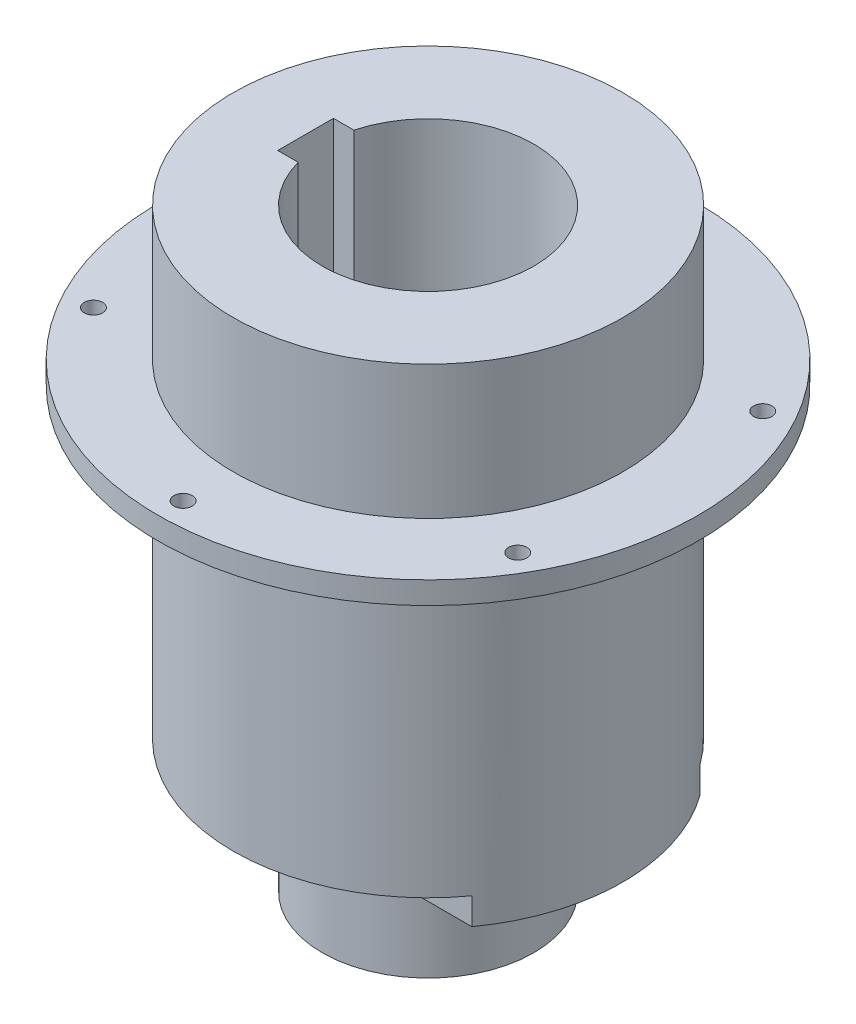
ISO-10303-21;
HEADER;
FILE_DESCRIPTION(('STEP AP214'),'2;1');
FILE_NAME('part.step','',(''),(''),'','','');
FILE_SCHEMA(('AUTOMOTIVE_DESIGN { 1 0 10303 214 1 1 1 1 }'));
ENDSEC;
DATA;
#1=APPLICATION_CONTEXT('core data for automotive mechanical design processes');
#2=APPLICATION_PROTOCOL_DEFINITION('international standard','automotive_design',2000,#1);
#3=PRODUCT_CONTEXT('',#1,'mechanical');
#4=PRODUCT('Part','Part','',(#3));
#5=PRODUCT_RELATED_PRODUCT_CATEGORY('part','',(#4));
#6=PRODUCT_DEFINITION_FORMATION('','',#4);
#7=PRODUCT_DEFINITION_CONTEXT('part definition',#1,'design');
#8=PRODUCT_DEFINITION('design','',#6,#7);
#9=PRODUCT_DEFINITION_SHAPE('','',#8);
#10=(LENGTH_UNIT() NAMED_UNIT(*) SI_UNIT(.MILLI.,.METRE.));
#11=(NAMED_UNIT(*) PLANE_ANGLE_UNIT() SI_UNIT($,.RADIAN.));
#12=(NAMED_UNIT(*) SI_UNIT($,.STERADIAN.) SOLID_ANGLE_UNIT());
#13=UNCERTAINTY_MEASURE_WITH_UNIT(LENGTH_MEASURE(1.E-05),#10,'distance_accuracy_value','');
#14=(GEOMETRIC_REPRESENTATION_CONTEXT(3) GLOBAL_UNCERTAINTY_ASSIGNED_CONTEXT((#13)) GLOBAL_UNIT_ASSIGNED_CONTEXT((#10,
#11,#12)) REPRESENTATION_CONTEXT('',''));
#15=CARTESIAN_POINT('',(0.,0.,0.));
#16=DIRECTION('',(0.,0.,1.));
#17=DIRECTION('',(1.,0.,0.));
#18=AXIS2_PLACEMENT_3D('',#15,#16,#17);
#19=CARTESIAN_POINT('',(0.,0.,0.));
#20=DIRECTION('',(0.,-1.,0.));
#21=DIRECTION('',(0.,0.,-1.));
#22=AXIS2_PLACEMENT_3D('',#19,#20,#21);
#23=CYLINDRICAL_SURFACE('',#22,35.);
#24=CARTESIAN_POINT('',(-34.9106001094224,56.8,-2.49999999999998));
#25=CARTESIAN_POINT('',(-34.9106013009842,56.9402337843813,-2.49999384622087));
#26=CARTESIAN_POINT('',(-34.9114541660582,57.0805646898059,-2.48816102267755));
#27=CARTESIAN_POINT('',(-34.9147737042987,57.3573485139249,-2.44112914296741));
#28=CARTESIAN_POINT('',(-34.9172422362129,57.4937967769307,-2.40590317341535));
#29=CARTESIAN_POINT('',(-34.9235120866206,57.7587661973504,-2.31310473405967));
#30=CARTESIAN_POINT('',(-34.9273126809974,57.88729161712,-2.25554440352309));
#31=CARTESIAN_POINT('',(-34.935817508379,58.1328240504901,-2.11973160545787));
#32=CARTESIAN_POINT('',(-34.9405215398181,58.2498336245994,-2.04148375205722));
#33=CARTESIAN_POINT('',(-34.9503133990893,58.4692701835359,-1.86635343582878));
#34=CARTESIAN_POINT('',(-34.9554018656616,58.5716720446524,-1.76943952624666));
#35=CARTESIAN_POINT('',(-34.9653833491045,58.7587709630079,-1.55979386399033));
#36=CARTESIAN_POINT('',(-34.9702763576651,58.8434672681323,-1.44706143970105));
#37=CARTESIAN_POINT('',(-34.979321378548,58.9928310580948,-1.20883323290622));
#38=CARTESIAN_POINT('',(-34.9834726035498,59.0574773149427,-1.08332410847656));
#39=CARTESIAN_POINT('',(-34.990559516592,59.1647700979797,-0.823198604146575));
#40=CARTESIAN_POINT('',(-34.9934952208912,59.2074169184361,-0.688582346091626));
#41=CARTESIAN_POINT('',(-34.9978158775822,59.2694293219075,-0.414309673484041));
#42=CARTESIAN_POINT('',(-34.9992034916227,59.288834868138,-0.274662337109923));
#43=CARTESIAN_POINT('',(-35.0002806084736,59.3039373357045,0.00591390353006725));
#44=CARTESIAN_POINT('',(-34.9999701353268,59.2996345927193,0.146842789622639));
#45=CARTESIAN_POINT('',(-34.9976882707688,59.2674754683555,0.425710880401213));
#46=CARTESIAN_POINT('',(-34.9957199102546,59.2396620680792,0.56365506991908));
#47=CARTESIAN_POINT('',(-34.9903472796657,59.1613379016685,0.83291189606865));
#48=CARTESIAN_POINT('',(-34.9869429990408,59.1108269687671,0.964224483967682));
#49=CARTESIAN_POINT('',(-34.9790764811396,58.988493187728,1.21662813510538));
#50=CARTESIAN_POINT('',(-34.9746132821527,58.9166509514763,1.33770977022086));
#51=CARTESIAN_POINT('',(-34.9651309405075,58.7537079910797,1.5661115188349));
#52=CARTESIAN_POINT('',(-34.9601117896154,58.6626069816829,1.67343142846343));
#53=CARTESIAN_POINT('',(-34.9500688682285,58.4634899476908,1.87151434561126));
#54=CARTESIAN_POINT('',(-34.9450451124509,58.3554366007797,1.96223984092649));
#55=CARTESIAN_POINT('',(-34.9355705444722,58.1256126128757,2.1242691127521));
#56=CARTESIAN_POINT('',(-34.931119732582,58.0038419644388,2.19557287872282));
#57=CARTESIAN_POINT('',(-34.9232938755889,57.7500151660184,2.31673245908851));
#58=CARTESIAN_POINT('',(-34.9199189169748,57.6179581901699,2.36658654923887));
#59=CARTESIAN_POINT('',(-34.9146282757894,57.3473189203907,2.44340496961031));
#60=CARTESIAN_POINT('',(-34.9127125707554,57.2087367269391,2.47036965217412));
#61=CARTESIAN_POINT('',(-34.9105607163687,56.9293084795045,2.50059679826772));
#62=CARTESIAN_POINT('',(-34.9103208674152,56.7884681005791,2.50391147163281));
#63=CARTESIAN_POINT('',(-34.911538102081,56.5082334937383,2.48688105832807));
#64=CARTESIAN_POINT('',(-34.9129951741237,56.3688392559636,2.46653613306751));
#65=CARTESIAN_POINT('',(-34.9174386845258,56.095602342522,2.40280747129512));
#66=CARTESIAN_POINT('',(-34.9204235182308,55.9617540009607,2.35944790599135));
#67=CARTESIAN_POINT('',(-34.9275848607993,55.7032332103979,2.25094529934471));
#68=CARTESIAN_POINT('',(-34.9317613837642,55.5785608699995,2.18580200022983));
#69=CARTESIAN_POINT('',(-34.9408444549612,55.3416916023663,2.03544819945193));
#70=CARTESIAN_POINT('',(-34.9457522675833,55.2295168823526,1.95020278976708));
#71=CARTESIAN_POINT('',(-34.9557405275265,55.0210510806753,1.76211522324265));
#72=CARTESIAN_POINT('',(-34.9608209770392,54.9247602007512,1.65927284293908));
#73=CARTESIAN_POINT('',(-34.9705929477922,54.7506183354553,1.43868558630042));
#74=CARTESIAN_POINT('',(-34.9752837452292,54.672801189308,1.32091395926634));
#75=CARTESIAN_POINT('',(-34.9837374668193,54.5380475327259,1.07394533913416));
#76=CARTESIAN_POINT('',(-34.9875003981072,54.4811108617317,0.944748433899802));
#77=CARTESIAN_POINT('',(-34.9936710038533,54.3897929492319,0.678719845089252));
#78=CARTESIAN_POINT('',(-34.9960799531813,54.3553904851127,0.541895477216689));
#79=CARTESIAN_POINT('',(-34.9992762933682,54.3100481280665,0.264394743307918));
#80=CARTESIAN_POINT('',(-35.0000637059758,54.2991079204535,0.123718428961321));
#81=CARTESIAN_POINT('',(-34.9999283072413,54.301003895361,-0.157158551507434));
#82=CARTESIAN_POINT('',(-34.9990092986799,54.3137872096869,-0.297359579385089));
#83=CARTESIAN_POINT('',(-34.9955718973575,54.3626574887243,-0.573618716668832));
#84=CARTESIAN_POINT('',(-34.9930535020031,54.3987444912206,-0.709676819357165));
#85=CARTESIAN_POINT('',(-34.9867001855664,54.4931851850029,-0.973793948539717));
#86=CARTESIAN_POINT('',(-34.9828652960376,54.5515383426196,-1.10185316666349));
#87=CARTESIAN_POINT('',(-34.9743089538449,54.6888482548665,-1.34636475268572));
#88=CARTESIAN_POINT('',(-34.9695875206224,54.7678045576959,-1.46281737502471));
#89=CARTESIAN_POINT('',(-34.95977620993,54.9442767570964,-1.68107963152584));
#90=CARTESIAN_POINT('',(-34.9546855778527,55.0418313693029,-1.78285792822938));
#91=CARTESIAN_POINT('',(-34.9447158885714,55.2526693719169,-1.96863172921551));
#92=CARTESIAN_POINT('',(-34.9398368832279,55.3659565894402,-2.05262289400752));
#93=CARTESIAN_POINT('',(-34.9308348795401,55.6052085770741,-2.20052035377927));
#94=CARTESIAN_POINT('',(-34.9267130155451,55.7311919382521,-2.2643966132442));
#95=CARTESIAN_POINT('',(-34.9197061867511,55.9920354706788,-2.37001000657714));
#96=CARTESIAN_POINT('',(-34.9168197844766,56.1268851138955,-2.41177288314433));
#97=CARTESIAN_POINT('',(-34.9133616093181,56.3521237055961,-2.46120496726509));
#98=CARTESIAN_POINT('',(-34.9123307263929,56.4410594479864,-2.47573408624045));
#99=CARTESIAN_POINT('',(-34.9109495946005,56.6199834521708,-2.4951335688605));
#100=CARTESIAN_POINT('',(-34.910599344455,56.7099717119875,-2.50000395064711));
#101=CARTESIAN_POINT('',(-34.9106001094224,56.8,-2.49999999999998));
#102=B_SPLINE_CURVE_WITH_KNOTS('',3,(#24,#25,#26,#27,#28,#29,#30,#31,#32,#33,#34,#35,#36,#37,
#38,#39,#40,#41,#42,#43,#44,#45,#46,#47,#48,#49,#50,#51,#52,#53,#54,#55,#56,#57,#58,#59,#60,#61,
#62,#63,#64,#65,#66,#67,#68,#69,#70,#71,#72,#73,#74,#75,#76,#77,#78,#79,#80,#81,#82,#83,#84,#85,
#86,#87,#88,#89,#90,#91,#92,#93,#94,#95,#96,#97,#98,#99,#100,#101),.UNSPECIFIED.,.T.,.F.,(4,2,2,
2,2,2,2,2,2,2,2,2,2,2,2,2,2,2,2,2,2,2,2,2,2,2,2,2,2,2,2,2,2,2,2,2,2,2,4),(0.,0.420372674340742,
0.841229819528212,1.26185853834788,1.68239351951577,2.10364327403619,2.52491091919571,
2.94662307084332,3.3683295814714,3.78930992470611,4.21028430741624,4.63049074442442,
5.05070026889243,5.47129289888782,5.89189175894008,6.31342995236851,6.73496837455419,
7.15654067602209,7.57810648799805,7.99874136118442,8.41937336475452,8.83956446964642,
9.25976054693389,9.68069175383475,10.101628306539,10.5233300601264,10.9450285709861,
11.3663293548796,11.7876244880682,12.2079818864761,12.6283399664575,13.0486879720403,
13.4690267606991,13.8902503059564,14.3115764981829,14.7335288625457,15.1549889364476,
15.4248632998187,15.6947371562869),.UNSPECIFIED.);
#103=CARTESIAN_POINT('',(-34.9106001094224,56.8,-2.49999999999998));
#104=VERTEX_POINT('',#103);
#105=EDGE_CURVE('E40',#104,#104,#102,.T.);
#106=ORIENTED_EDGE('',*,*,#105,.T.);
#107=EDGE_LOOP('',(#106));
#108=FACE_BOUND('',#107,.T.);
#109=CARTESIAN_POINT('',(0.,23.8,0.));
#110=DIRECTION('',(0.,1.,0.));
#111=DIRECTION('',(0.,0.,1.));
#112=AXIS2_PLACEMENT_3D('',#109,#110,#111);
#113=CIRCLE('',#112,35.);
#114=CARTESIAN_POINT('',(28.3681159050086,23.8,-20.5));
#115=VERTEX_POINT('',#114);
#116=CARTESIAN_POINT('',(-28.3681159050086,23.8,-20.5));
#117=VERTEX_POINT('',#116);
#118=EDGE_CURVE('E11',#115,#117,#113,.T.);
#119=ORIENTED_EDGE('',*,*,#118,.T.);
#120=DIRECTION('',(0.,-1.,0.));
#121=VECTOR('',#120,1.);
#122=CARTESIAN_POINT('',(-28.3681159050086,0.,-20.5));
#123=LINE('',#122,#121);
#124=CARTESIAN_POINT('',(-28.3681159050086,19.,-20.5));
#125=VERTEX_POINT('',#124);
#126=EDGE_CURVE('E213',#117,#125,#123,.T.);
#127=ORIENTED_EDGE('',*,*,#126,.T.);
#128=CARTESIAN_POINT('',(0.,19.,0.));
#129=DIRECTION('',(0.,-1.,0.));
#130=DIRECTION('',(0.,0.,-1.));
#131=AXIS2_PLACEMENT_3D('',#128,#129,#130);
#132=CIRCLE('',#131,35.);
#133=CARTESIAN_POINT('',(-28.3681159050086,19.,20.5));
#134=VERTEX_POINT('',#133);
#135=EDGE_CURVE('E293',#134,#125,#132,.T.);
#136=ORIENTED_EDGE('',*,*,#135,.F.);
#137=DIRECTION('',(0.,-1.,0.));
#138=VECTOR('',#137,1.);
#139=CARTESIAN_POINT('',(-28.3681159050086,0.,20.5));
#140=LINE('',#139,#138);
#141=CARTESIAN_POINT('',(-28.3681159050086,23.8,20.5));
#142=VERTEX_POINT('',#141);
#143=EDGE_CURVE('E65',#134,#142,#140,.F.);
#144=ORIENTED_EDGE('',*,*,#143,.T.);
#145=CARTESIAN_POINT('',(0.,23.8,0.));
#146=DIRECTION('',(0.,1.,0.));
#147=DIRECTION('',(0.,0.,1.));
#148=AXIS2_PLACEMENT_3D('',#145,#146,#147);
#149=CIRCLE('',#148,35.);
#150=CARTESIAN_POINT('',(28.3681159050086,23.8,20.5));
#151=VERTEX_POINT('',#150);
#152=EDGE_CURVE('E316',#142,#151,#149,.T.);
#153=ORIENTED_EDGE('',*,*,#152,.T.);
#154=DIRECTION('',(0.,-1.,0.));
#155=VECTOR('',#154,1.);
#156=CARTESIAN_POINT('',(28.3681159050086,0.,20.5));
#157=LINE('',#156,#155);
#158=CARTESIAN_POINT('',(28.3681159050085,19.,20.5));
#159=VERTEX_POINT('',#158);
#160=EDGE_CURVE('E220',#151,#159,#157,.T.);
#161=ORIENTED_EDGE('',*,*,#160,.T.);
#162=CARTESIAN_POINT('',(28.3681159050086,19.,-20.5));
#163=VERTEX_POINT('',#162);
#164=EDGE_CURVE('E292',#163,#159,#132,.T.);
#165=ORIENTED_EDGE('',*,*,#164,.F.);
#166=DIRECTION('',(0.,-1.,0.));
#167=VECTOR('',#166,1.);
#168=CARTESIAN_POINT('',(28.3681159050086,0.,-20.5));
#169=LINE('',#168,#167);
#170=EDGE_CURVE('E57',#163,#115,#169,.F.);
#171=ORIENTED_EDGE('',*,*,#170,.T.);
#172=EDGE_LOOP('',(#119,#127,#136,#144,#153,#161,#165,#171));
#173=FACE_BOUND('',#172,.T.);
#174=CARTESIAN_POINT('',(0.,78.8,0.));
#175=DIRECTION('',(0.,1.,0.));
#176=DIRECTION('',(0.,0.,1.));
#177=AXIS2_PLACEMENT_3D('',#174,#175,#176);
#178=CIRCLE('',#177,35.);
#179=CARTESIAN_POINT('',(0.,78.8,35.));
#180=VERTEX_POINT('',#179);
#181=EDGE_CURVE('E311',#180,#180,#178,.T.);
#182=ORIENTED_EDGE('',*,*,#181,.F.);
#183=EDGE_LOOP('',(#182));
#184=FACE_BOUND('',#183,.T.);
#185=ADVANCED_FACE('F36',(#108,#173,#184),#23,.T.);
#186=CARTESIAN_POINT('',(0.,106.8,0.));
#187=DIRECTION('',(0.,-1.,0.));
#188=DIRECTION('',(0.,0.,-1.));
#189=AXIS2_PLACEMENT_3D('',#186,#187,#188);
#190=CIRCLE('',#189,35.);
#191=CARTESIAN_POINT('',(0.,106.8,-35.));
#192=VERTEX_POINT('',#191);
#193=EDGE_CURVE('E296',#192,#192,#190,.T.);
#194=ORIENTED_EDGE('',*,*,#193,.T.);
#195=EDGE_LOOP('',(#194));
#196=FACE_BOUND('',#195,.T.);
#197=CARTESIAN_POINT('',(0.,82.8,0.));
#198=DIRECTION('',(0.,-1.,0.));
#199=DIRECTION('',(0.,0.,-1.));
#200=AXIS2_PLACEMENT_3D('',#197,#198,#199);
#201=CIRCLE('',#200,35.);
#202=CARTESIAN_POINT('',(0.,82.8,-35.));
#203=VERTEX_POINT('',#202);
#204=EDGE_CURVE('E308',#203,#203,#201,.T.);
#205=ORIENTED_EDGE('',*,*,#204,.F.);
#206=EDGE_LOOP('',(#205));
#207=FACE_BOUND('',#206,.T.);
#208=ADVANCED_FACE('F346',(#196,#207),#23,.T.);
#209=CARTESIAN_POINT('',(0.,0.,0.));
#210=DIRECTION('',(0.,-1.,0.));
#211=DIRECTION('',(0.,0.,-1.));
#212=AXIS2_PLACEMENT_3D('',#209,#210,#211);
#213=CYLINDRICAL_SURFACE('',#212,6.5);
#214=CARTESIAN_POINT('',(0.,26.3,0.));
#215=DIRECTION('',(0.,-1.,0.));
#216=DIRECTION('',(0.,0.,-1.));
#217=AXIS2_PLACEMENT_3D('',#214,#215,#216);
#218=CIRCLE('',#217,6.5);
#219=CARTESIAN_POINT('',(0.,26.3,-6.5));
#220=VERTEX_POINT('',#219);
#221=EDGE_CURVE('E305',#220,#220,#218,.T.);
#222=ORIENTED_EDGE('',*,*,#221,.F.);
#223=EDGE_LOOP('',(#222));
#224=FACE_BOUND('',#223,.T.);
#225=CARTESIAN_POINT('',(0.,15.,0.));
#226=DIRECTION('',(0.,-1.,0.));
#227=DIRECTION('',(0.,0.,-1.));
#228=AXIS2_PLACEMENT_3D('',#225,#226,#227);
#229=CIRCLE('',#228,6.5);
#230=CARTESIAN_POINT('',(0.,15.,-6.5));
#231=VERTEX_POINT('',#230);
#232=EDGE_CURVE('E277',#231,#231,#229,.T.);
#233=ORIENTED_EDGE('',*,*,#232,.T.);
#234=EDGE_LOOP('',(#233));
#235=FACE_BOUND('',#234,.T.);
#236=ADVANCED_FACE('F38',(#224,#235),#213,.F.);
#237=CARTESIAN_POINT('',(-6.5,26.3,0.));
#238=DIRECTION('',(0.,-1.,0.));
#239=DIRECTION('',(0.,0.,-1.));
#240=AXIS2_PLACEMENT_3D('',#237,#238,#239);
#241=PLANE('',#240);
#242=DIRECTION('',(0.,0.,-1.));
#243=VECTOR('',#242,1.);
#244=CARTESIAN_POINT('',(-14.,26.3,-5.));
#245=LINE('',#244,#243);
#246=CARTESIAN_POINT('',(-14.,26.3,5.));
#247=VERTEX_POINT('',#246);
#248=CARTESIAN_POINT('',(-14.,26.3,-5.));
#249=VERTEX_POINT('',#248);
#250=EDGE_CURVE('E246',#247,#249,#245,.T.);
#251=ORIENTED_EDGE('',*,*,#250,.F.);
#252=DIRECTION('',(1.,0.,0.));
#253=VECTOR('',#252,1.);
#254=CARTESIAN_POINT('',(-22.,26.3,5.));
#255=LINE('',#254,#253);
#256=CARTESIAN_POINT('',(-18.3303027798234,26.3,5.));
#257=VERTEX_POINT('',#256);
#258=EDGE_CURVE('E249',#257,#247,#255,.T.);
#259=ORIENTED_EDGE('',*,*,#258,.F.);
#260=CARTESIAN_POINT('',(0.,26.3,0.));
#261=DIRECTION('',(0.,-1.,0.));
#262=DIRECTION('',(0.,0.,-1.));
#263=AXIS2_PLACEMENT_3D('',#260,#261,#262);
#264=CIRCLE('',#263,19.);
#265=CARTESIAN_POINT('',(-18.3303027798234,26.3,-5.));
#266=VERTEX_POINT('',#265);
#267=EDGE_CURVE('E302',#266,#257,#264,.T.);
#268=ORIENTED_EDGE('',*,*,#267,.F.);
#269=DIRECTION('',(-1.,0.,0.));
#270=VECTOR('',#269,1.);
#271=CARTESIAN_POINT('',(-22.,26.3,-5.));
#272=LINE('',#271,#270);
#273=EDGE_CURVE('E275',#249,#266,#272,.T.);
#274=ORIENTED_EDGE('',*,*,#273,.F.);
#275=EDGE_LOOP('',(#251,#259,#268,#274));
#276=FACE_BOUND('',#275,.T.);
#277=ORIENTED_EDGE('',*,*,#221,.T.);
#278=EDGE_LOOP('',(#277));
#279=FACE_BOUND('',#278,.T.);
#280=ADVANCED_FACE('F365',(#276,#279),#241,.F.);
#281=CARTESIAN_POINT('',(0.,0.,0.));
#282=DIRECTION('',(0.,-1.,0.));
#283=DIRECTION('',(0.,0.,-1.));
#284=AXIS2_PLACEMENT_3D('',#281,#282,#283);
#285=CYLINDRICAL_SURFACE('',#284,19.);
#286=ORIENTED_EDGE('',*,*,#267,.T.);
#287=DIRECTION('',(0.,-1.,0.));
#288=VECTOR('',#287,1.);
#289=CARTESIAN_POINT('',(-18.3303027798234,0.,5.));
#290=LINE('',#289,#288);
#291=CARTESIAN_POINT('',(-18.3303027798234,106.8,5.));
#292=VERTEX_POINT('',#291);
#293=EDGE_CURVE('E231',#292,#257,#290,.T.);
#294=ORIENTED_EDGE('',*,*,#293,.F.);
#295=CARTESIAN_POINT('',(0.,106.8,0.));
#296=DIRECTION('',(0.,-1.,0.));
#297=DIRECTION('',(0.,0.,-1.));
#298=AXIS2_PLACEMENT_3D('',#295,#296,#297);
#299=CIRCLE('',#298,19.);
#300=CARTESIAN_POINT('',(-18.3303027798234,106.8,-5.));
#301=VERTEX_POINT('',#300);
#302=EDGE_CURVE('E299',#301,#292,#299,.T.);
#303=ORIENTED_EDGE('',*,*,#302,.F.);
#304=DIRECTION('',(0.,-1.,0.));
#305=VECTOR('',#304,1.);
#306=CARTESIAN_POINT('',(-18.3303027798234,0.,-5.));
#307=LINE('',#306,#305);
#308=EDGE_CURVE('E229',#266,#301,#307,.F.);
#309=ORIENTED_EDGE('',*,*,#308,.F.);
#310=EDGE_LOOP('',(#286,#294,#303,#309));
#311=FACE_BOUND('',#310,.T.);
#312=ADVANCED_FACE('F362',(#311),#285,.F.);
#313=CARTESIAN_POINT('',(-19.,106.8,0.));
#314=DIRECTION('',(0.,-1.,0.));
#315=DIRECTION('',(0.,0.,-1.));
#316=AXIS2_PLACEMENT_3D('',#313,#314,#315);
#317=PLANE('',#316);
#318=ORIENTED_EDGE('',*,*,#193,.F.);
#319=EDGE_LOOP('',(#318));
#320=FACE_BOUND('',#319,.T.);
#321=ORIENTED_EDGE('',*,*,#302,.T.);
#322=DIRECTION('',(1.,0.,0.));
#323=VECTOR('',#322,1.);
#324=CARTESIAN_POINT('',(-22.,106.8,5.));
#325=LINE('',#324,#323);
#326=CARTESIAN_POINT('',(-22.,106.8,5.));
#327=VERTEX_POINT('',#326);
#328=EDGE_CURVE('E258',#327,#292,#325,.T.);
#329=ORIENTED_EDGE('',*,*,#328,.F.);
#330=DIRECTION('',(0.,0.,1.));
#331=VECTOR('',#330,1.);
#332=CARTESIAN_POINT('',(-22.,106.8,-5.));
#333=LINE('',#332,#331);
#334=CARTESIAN_POINT('',(-22.,106.8,-5.));
#335=VERTEX_POINT('',#334);
#336=EDGE_CURVE('E255',#335,#327,#333,.T.);
#337=ORIENTED_EDGE('',*,*,#336,.F.);
#338=DIRECTION('',(-1.,0.,0.));
#339=VECTOR('',#338,1.);
#340=CARTESIAN_POINT('',(-22.,106.8,-5.));
#341=LINE('',#340,#339);
#342=EDGE_CURVE('E252',#301,#335,#341,.T.);
#343=ORIENTED_EDGE('',*,*,#342,.F.);
#344=EDGE_LOOP('',(#321,#329,#337,#343));
#345=FACE_BOUND('',#344,.T.);
#346=ADVANCED_FACE('F359',(#320,#345),#317,.F.);
#347=CARTESIAN_POINT('',(-35.,19.,0.));
#348=DIRECTION('',(0.,1.,0.));
#349=DIRECTION('',(0.,0.,1.));
#350=AXIS2_PLACEMENT_3D('',#347,#348,#349);
#351=PLANE('',#350);
#352=CARTESIAN_POINT('',(27.5,19.,0.));
#353=DIRECTION('',(0.,-1.,0.));
#354=DIRECTION('',(0.,0.,-1.));
#355=AXIS2_PLACEMENT_3D('',#352,#353,#354);
#356=CIRCLE('',#355,3.49999999999999);
#357=CARTESIAN_POINT('',(27.5,19.,-3.49999999999999));
#358=VERTEX_POINT('',#357);
#359=EDGE_CURVE('E155',#358,#358,#356,.T.);
#360=ORIENTED_EDGE('',*,*,#359,.F.);
#361=EDGE_LOOP('',(#360));
#362=FACE_BOUND('',#361,.T.);
#363=CARTESIAN_POINT('',(-27.5,19.,0.));
#364=DIRECTION('',(0.,-1.,0.));
#365=DIRECTION('',(0.,0.,-1.));
#366=AXIS2_PLACEMENT_3D('',#363,#364,#365);
#367=CIRCLE('',#366,3.49999999999999);
#368=CARTESIAN_POINT('',(-27.5,19.,-3.49999999999999));
#369=VERTEX_POINT('',#368);
#370=EDGE_CURVE('E154',#369,#369,#367,.T.);
#371=ORIENTED_EDGE('',*,*,#370,.F.);
#372=EDGE_LOOP('',(#371));
#373=FACE_BOUND('',#372,.T.);
#374=DIRECTION('',(0.,0.,-1.));
#375=VECTOR('',#374,1.);
#376=CARTESIAN_POINT('',(-22.,19.,-5.));
#377=LINE('',#376,#375);
#378=CARTESIAN_POINT('',(-22.,19.,5.));
#379=VERTEX_POINT('',#378);
#380=CARTESIAN_POINT('',(-22.,19.,-5.));
#381=VERTEX_POINT('',#380);
#382=EDGE_CURVE('E240',#379,#381,#377,.T.);
#383=ORIENTED_EDGE('',*,*,#382,.F.);
#384=DIRECTION('',(-1.,0.,0.));
#385=VECTOR('',#384,1.);
#386=CARTESIAN_POINT('',(-22.,19.,5.));
#387=LINE('',#386,#385);
#388=CARTESIAN_POINT('',(-18.3303027798234,19.,5.));
#389=VERTEX_POINT('',#388);
#390=EDGE_CURVE('E243',#389,#379,#387,.T.);
#391=ORIENTED_EDGE('',*,*,#390,.F.);
#392=CARTESIAN_POINT('',(0.,19.,0.));
#393=DIRECTION('',(0.,-1.,0.));
#394=DIRECTION('',(0.,0.,-1.));
#395=AXIS2_PLACEMENT_3D('',#392,#393,#394);
#396=CIRCLE('',#395,19.);
#397=CARTESIAN_POINT('',(-18.3303027798234,19.,-5.));
#398=VERTEX_POINT('',#397);
#399=EDGE_CURVE('E289',#398,#389,#396,.T.);
#400=ORIENTED_EDGE('',*,*,#399,.F.);
#401=DIRECTION('',(1.,0.,0.));
#402=VECTOR('',#401,1.);
#403=CARTESIAN_POINT('',(-22.,19.,-5.));
#404=LINE('',#403,#402);
#405=EDGE_CURVE('E273',#381,#398,#404,.T.);
#406=ORIENTED_EDGE('',*,*,#405,.F.);
#407=EDGE_LOOP('',(#383,#391,#400,#406));
#408=FACE_BOUND('',#407,.T.);
#409=ORIENTED_EDGE('',*,*,#135,.T.);
#410=DIRECTION('',(1.,0.,0.));
#411=VECTOR('',#410,1.);
#412=CARTESIAN_POINT('',(-35.,19.,-20.5));
#413=LINE('',#412,#411);
#414=EDGE_CURVE('E49',#125,#163,#413,.T.);
#415=ORIENTED_EDGE('',*,*,#414,.T.);
#416=ORIENTED_EDGE('',*,*,#164,.T.);
#417=DIRECTION('',(-1.,0.,0.));
#418=VECTOR('',#417,1.);
#419=CARTESIAN_POINT('',(-35.,19.,20.5));
#420=LINE('',#419,#418);
#421=EDGE_CURVE('E314',#159,#134,#420,.T.);
#422=ORIENTED_EDGE('',*,*,#421,.T.);
#423=EDGE_LOOP('',(#409,#415,#416,#422));
#424=FACE_BOUND('',#423,.T.);
#425=ADVANCED_FACE('F357',(#362,#373,#408,#424),#351,.F.);
#426=CARTESIAN_POINT('',(0.,0.,0.));
#427=DIRECTION('',(0.,-1.,0.));
#428=DIRECTION('',(0.,0.,-1.));
#429=AXIS2_PLACEMENT_3D('',#426,#427,#428);
#430=CYLINDRICAL_SURFACE('',#429,19.);
#431=ORIENTED_EDGE('',*,*,#399,.T.);
#432=DIRECTION('',(0.,-1.,0.));
#433=VECTOR('',#432,1.);
#434=CARTESIAN_POINT('',(-18.3303027798234,0.,5.));
#435=LINE('',#434,#433);
#436=CARTESIAN_POINT('',(-18.3303027798234,0.,5.));
#437=VERTEX_POINT('',#436);
#438=EDGE_CURVE('E238',#437,#389,#435,.F.);
#439=ORIENTED_EDGE('',*,*,#438,.F.);
#440=CARTESIAN_POINT('',(0.,0.,0.));
#441=DIRECTION('',(0.,-1.,0.));
#442=DIRECTION('',(0.,0.,-1.));
#443=AXIS2_PLACEMENT_3D('',#440,#441,#442);
#444=CIRCLE('',#443,19.);
#445=CARTESIAN_POINT('',(-18.3303027798234,0.,-5.));
#446=VERTEX_POINT('',#445);
#447=EDGE_CURVE('E286',#446,#437,#444,.T.);
#448=ORIENTED_EDGE('',*,*,#447,.F.);
#449=DIRECTION('',(0.,-1.,0.));
#450=VECTOR('',#449,1.);
#451=CARTESIAN_POINT('',(-18.3303027798234,0.,-5.));
#452=LINE('',#451,#450);
#453=EDGE_CURVE('E271',#398,#446,#452,.T.);
#454=ORIENTED_EDGE('',*,*,#453,.F.);
#455=EDGE_LOOP('',(#431,#439,#448,#454));
#456=FACE_BOUND('',#455,.T.);
#457=ADVANCED_FACE('F397',(#456),#430,.T.);
#458=CARTESIAN_POINT('',(-19.,0.,0.));
#459=DIRECTION('',(0.,1.,0.));
#460=DIRECTION('',(0.,0.,1.));
#461=AXIS2_PLACEMENT_3D('',#458,#459,#460);
#462=PLANE('',#461);
#463=CARTESIAN_POINT('',(0.,0.,0.));
#464=DIRECTION('',(0.,-1.,0.));
#465=DIRECTION('',(0.,0.,-1.));
#466=AXIS2_PLACEMENT_3D('',#463,#464,#465);
#467=CIRCLE('',#466,10.);
#468=CARTESIAN_POINT('',(0.,0.,-10.));
#469=VERTEX_POINT('',#468);
#470=EDGE_CURVE('E283',#469,#469,#467,.T.);
#471=ORIENTED_EDGE('',*,*,#470,.F.);
#472=EDGE_LOOP('',(#471));
#473=FACE_BOUND('',#472,.T.);
#474=ORIENTED_EDGE('',*,*,#447,.T.);
#475=DIRECTION('',(-1.,0.,0.));
#476=VECTOR('',#475,1.);
#477=CARTESIAN_POINT('',(-22.,0.,5.));
#478=LINE('',#477,#476);
#479=CARTESIAN_POINT('',(-14.,0.,5.));
#480=VERTEX_POINT('',#479);
#481=EDGE_CURVE('E236',#480,#437,#478,.T.);
#482=ORIENTED_EDGE('',*,*,#481,.F.);
#483=DIRECTION('',(0.,0.,1.));
#484=VECTOR('',#483,1.);
#485=CARTESIAN_POINT('',(-14.,0.,-5.));
#486=LINE('',#485,#484);
#487=CARTESIAN_POINT('',(-14.,0.,-5.));
#488=VERTEX_POINT('',#487);
#489=EDGE_CURVE('E233',#488,#480,#486,.T.);
#490=ORIENTED_EDGE('',*,*,#489,.F.);
#491=DIRECTION('',(1.,0.,0.));
#492=VECTOR('',#491,1.);
#493=CARTESIAN_POINT('',(-22.,0.,-5.));
#494=LINE('',#493,#492);
#495=EDGE_CURVE('E263',#446,#488,#494,.T.);
#496=ORIENTED_EDGE('',*,*,#495,.F.);
#497=EDGE_LOOP('',(#474,#482,#490,#496));
#498=FACE_BOUND('',#497,.T.);
#499=ADVANCED_FACE('F391',(#473,#498),#462,.F.);
#500=CARTESIAN_POINT('',(0.,0.,0.));
#501=DIRECTION('',(0.,-1.,0.));
#502=DIRECTION('',(0.,0.,-1.));
#503=AXIS2_PLACEMENT_3D('',#500,#501,#502);
#504=CYLINDRICAL_SURFACE('',#503,10.);
#505=CARTESIAN_POINT('',(0.,15.,0.));
#506=DIRECTION('',(0.,-1.,0.));
#507=DIRECTION('',(0.,0.,-1.));
#508=AXIS2_PLACEMENT_3D('',#505,#506,#507);
#509=CIRCLE('',#508,10.);
#510=CARTESIAN_POINT('',(0.,15.,-10.));
#511=VERTEX_POINT('',#510);
#512=EDGE_CURVE('E280',#511,#511,#509,.T.);
#513=ORIENTED_EDGE('',*,*,#512,.F.);
#514=EDGE_LOOP('',(#513));
#515=FACE_BOUND('',#514,.T.);
#516=ORIENTED_EDGE('',*,*,#470,.T.);
#517=EDGE_LOOP('',(#516));
#518=FACE_BOUND('',#517,.T.);
#519=ADVANCED_FACE('F385',(#515,#518),#504,.F.);
#520=CARTESIAN_POINT('',(-10.,15.,0.));
#521=DIRECTION('',(0.,1.,0.));
#522=DIRECTION('',(0.,0.,1.));
#523=AXIS2_PLACEMENT_3D('',#520,#521,#522);
#524=PLANE('',#523);
#525=ORIENTED_EDGE('',*,*,#232,.F.);
#526=EDGE_LOOP('',(#525));
#527=FACE_BOUND('',#526,.T.);
#528=ORIENTED_EDGE('',*,*,#512,.T.);
#529=EDGE_LOOP('',(#528));
#530=FACE_BOUND('',#529,.T.);
#531=ADVANCED_FACE('F381',(#527,#530),#524,.F.);
#532=CARTESIAN_POINT('',(-14.,-0.001000000000001,-5.));
#533=DIRECTION('',(1.,0.,0.));
#534=DIRECTION('',(0.,0.,-1.));
#535=AXIS2_PLACEMENT_3D('',#532,#533,#534);
#536=PLANE('',#535);
#537=ORIENTED_EDGE('',*,*,#250,.T.);
#538=DIRECTION('',(0.,1.,0.));
#539=VECTOR('',#538,1.);
#540=CARTESIAN_POINT('',(-14.,-0.001000000000001,-5.));
#541=LINE('',#540,#539);
#542=EDGE_CURVE('E260',#488,#249,#541,.T.);
#543=ORIENTED_EDGE('',*,*,#542,.F.);
#544=ORIENTED_EDGE('',*,*,#489,.T.);
#545=DIRECTION('',(0.,1.,0.));
#546=VECTOR('',#545,1.);
#547=CARTESIAN_POINT('',(-14.,-0.001000000000001,5.));
#548=LINE('',#547,#546);
#549=EDGE_CURVE('E261',#480,#247,#548,.T.);
#550=ORIENTED_EDGE('',*,*,#549,.T.);
#551=EDGE_LOOP('',(#537,#543,#544,#550));
#552=FACE_BOUND('',#551,.T.);
#553=ADVANCED_FACE('F384',(#552),#536,.F.);
#554=CARTESIAN_POINT('',(-22.,-0.001000000000001,5.));
#555=DIRECTION('',(0.,0.,1.));
#556=DIRECTION('',(1.,0.,0.));
#557=AXIS2_PLACEMENT_3D('',#554,#555,#556);
#558=PLANE('',#557);
#559=ORIENTED_EDGE('',*,*,#258,.T.);
#560=ORIENTED_EDGE('',*,*,#549,.F.);
#561=ORIENTED_EDGE('',*,*,#481,.T.);
#562=ORIENTED_EDGE('',*,*,#438,.T.);
#563=ORIENTED_EDGE('',*,*,#390,.T.);
#564=DIRECTION('',(0.,1.,0.));
#565=VECTOR('',#564,1.);
#566=CARTESIAN_POINT('',(-22.,-0.001000000000001,5.));
#567=LINE('',#566,#565);
#568=EDGE_CURVE('E264',#379,#327,#567,.T.);
#569=ORIENTED_EDGE('',*,*,#568,.T.);
#570=ORIENTED_EDGE('',*,*,#328,.T.);
#571=ORIENTED_EDGE('',*,*,#293,.T.);
#572=EDGE_LOOP('',(#559,#560,#561,#562,#563,#569,#570,#571));
#573=FACE_BOUND('',#572,.T.);
#574=ADVANCED_FACE('F409',(#573),#558,.F.);
#575=CARTESIAN_POINT('',(-22.,-0.001000000000001,-5.));
#576=DIRECTION('',(-1.,0.,0.));
#577=DIRECTION('',(0.,0.,1.));
#578=AXIS2_PLACEMENT_3D('',#575,#576,#577);
#579=PLANE('',#578);
#580=CARTESIAN_POINT('',(-22.,56.8,0.));
#581=DIRECTION('',(1.,0.,0.));
#582=DIRECTION('',(0.,0.,-1.));
#583=AXIS2_PLACEMENT_3D('',#580,#581,#582);
#584=CIRCLE('',#583,2.49999999999999);
#585=CARTESIAN_POINT('',(-22.,56.8,-2.49999999999998));
#586=VERTEX_POINT('',#585);
#587=EDGE_CURVE('E465',#586,#586,#584,.T.);
#588=ORIENTED_EDGE('',*,*,#587,.F.);
#589=EDGE_LOOP('',(#588));
#590=FACE_BOUND('',#589,.T.);
#591=ORIENTED_EDGE('',*,*,#382,.T.);
#592=DIRECTION('',(0.,1.,0.));
#593=VECTOR('',#592,1.);
#594=CARTESIAN_POINT('',(-22.,-0.001000000000001,-5.));
#595=LINE('',#594,#593);
#596=EDGE_CURVE('E266',#381,#335,#595,.T.);
#597=ORIENTED_EDGE('',*,*,#596,.T.);
#598=ORIENTED_EDGE('',*,*,#336,.T.);
#599=ORIENTED_EDGE('',*,*,#568,.F.);
#600=EDGE_LOOP('',(#591,#597,#598,#599));
#601=FACE_BOUND('',#600,.T.);
#602=ADVANCED_FACE('F415',(#590,#601),#579,.F.);
#603=CARTESIAN_POINT('',(-22.,-0.001000000000001,-5.));
#604=DIRECTION('',(0.,0.,-1.));
#605=DIRECTION('',(-1.,0.,0.));
#606=AXIS2_PLACEMENT_3D('',#603,#604,#605);
#607=PLANE('',#606);
#608=ORIENTED_EDGE('',*,*,#273,.T.);
#609=ORIENTED_EDGE('',*,*,#308,.T.);
#610=ORIENTED_EDGE('',*,*,#342,.T.);
#611=ORIENTED_EDGE('',*,*,#596,.F.);
#612=ORIENTED_EDGE('',*,*,#405,.T.);
#613=ORIENTED_EDGE('',*,*,#453,.T.);
#614=ORIENTED_EDGE('',*,*,#495,.T.);
#615=ORIENTED_EDGE('',*,*,#542,.T.);
#616=EDGE_LOOP('',(#608,#609,#610,#611,#612,#613,#614,#615));
#617=FACE_BOUND('',#616,.T.);
#618=ADVANCED_FACE('F425',(#617),#607,.F.);
#619=CARTESIAN_POINT('',(-35.,78.8,0.));
#620=DIRECTION('',(0.,1.,0.));
#621=DIRECTION('',(0.,0.,1.));
#622=AXIS2_PLACEMENT_3D('',#619,#620,#621);
#623=PLANE('',#622);
#624=CARTESIAN_POINT('',(38.1051177665153,78.8,22.));
#625=DIRECTION('',(0.,1.,0.));
#626=DIRECTION('',(0.,0.,1.));
#627=AXIS2_PLACEMENT_3D('',#624,#625,#626);
#628=CIRCLE('',#627,1.65);
#629=CARTESIAN_POINT('',(38.1051177665153,78.8,23.65));
#630=VERTEX_POINT('',#629);
#631=EDGE_CURVE('E177',#630,#630,#628,.T.);
#632=ORIENTED_EDGE('',*,*,#631,.T.);
#633=EDGE_LOOP('',(#632));
#634=FACE_BOUND('',#633,.T.);
#635=CARTESIAN_POINT('',(38.1051177665153,78.8,-22.));
#636=DIRECTION('',(0.,1.,0.));
#637=DIRECTION('',(0.,0.,1.));
#638=AXIS2_PLACEMENT_3D('',#635,#636,#637);
#639=CIRCLE('',#638,1.65);
#640=CARTESIAN_POINT('',(38.1051177665153,78.8,-20.35));
#641=VERTEX_POINT('',#640);
#642=EDGE_CURVE('E183',#641,#641,#639,.T.);
#643=ORIENTED_EDGE('',*,*,#642,.T.);
#644=EDGE_LOOP('',(#643));
#645=FACE_BOUND('',#644,.T.);
#646=CARTESIAN_POINT('',(0.,78.8,-44.));
#647=DIRECTION('',(0.,1.,0.));
#648=DIRECTION('',(0.,0.,1.));
#649=AXIS2_PLACEMENT_3D('',#646,#647,#648);
#650=CIRCLE('',#649,1.65);
#651=CARTESIAN_POINT('',(0.,78.8,-42.35));
#652=VERTEX_POINT('',#651);
#653=EDGE_CURVE('E189',#652,#652,#650,.T.);
#654=ORIENTED_EDGE('',*,*,#653,.T.);
#655=EDGE_LOOP('',(#654));
#656=FACE_BOUND('',#655,.T.);
#657=CARTESIAN_POINT('',(-38.1051177665153,78.8,-22.));
#658=DIRECTION('',(0.,1.,0.));
#659=DIRECTION('',(0.,0.,1.));
#660=AXIS2_PLACEMENT_3D('',#657,#658,#659);
#661=CIRCLE('',#660,1.65);
#662=CARTESIAN_POINT('',(-38.1051177665153,78.8,-20.35));
#663=VERTEX_POINT('',#662);
#664=EDGE_CURVE('E195',#663,#663,#661,.T.);
#665=ORIENTED_EDGE('',*,*,#664,.T.);
#666=EDGE_LOOP('',(#665));
#667=FACE_BOUND('',#666,.T.);
#668=CARTESIAN_POINT('',(-38.1051177665153,78.8,22.));
#669=DIRECTION('',(0.,1.,0.));
#670=DIRECTION('',(0.,0.,1.));
#671=AXIS2_PLACEMENT_3D('',#668,#669,#670);
#672=CIRCLE('',#671,1.65);
#673=CARTESIAN_POINT('',(-38.1051177665153,78.8,23.65));
#674=VERTEX_POINT('',#673);
#675=EDGE_CURVE('E201',#674,#674,#672,.T.);
#676=ORIENTED_EDGE('',*,*,#675,.T.);
#677=EDGE_LOOP('',(#676));
#678=FACE_BOUND('',#677,.T.);
#679=CARTESIAN_POINT('',(0.,78.8,44.));
#680=DIRECTION('',(0.,1.,0.));
#681=DIRECTION('',(0.,0.,1.));
#682=AXIS2_PLACEMENT_3D('',#679,#680,#681);
#683=CIRCLE('',#682,1.65);
#684=CARTESIAN_POINT('',(0.,78.8,45.65));
#685=VERTEX_POINT('',#684);
#686=EDGE_CURVE('E207',#685,#685,#683,.T.);
#687=ORIENTED_EDGE('',*,*,#686,.T.);
#688=EDGE_LOOP('',(#687));
#689=FACE_BOUND('',#688,.T.);
#690=ORIENTED_EDGE('',*,*,#181,.T.);
#691=EDGE_LOOP('',(#690));
#692=FACE_BOUND('',#691,.T.);
#693=CARTESIAN_POINT('',(0.,78.8,0.));
#694=DIRECTION('',(0.,-1.,0.));
#695=DIRECTION('',(0.,0.,-1.));
#696=AXIS2_PLACEMENT_3D('',#693,#694,#695);
#697=CIRCLE('',#696,48.5);
#698=CARTESIAN_POINT('',(0.,78.8,-48.5));
#699=VERTEX_POINT('',#698);
#700=EDGE_CURVE('E226',#699,#699,#697,.T.);
#701=ORIENTED_EDGE('',*,*,#700,.T.);
#702=EDGE_LOOP('',(#701));
#703=FACE_BOUND('',#702,.T.);
#704=ADVANCED_FACE('F472',(#634,#645,#656,#667,#678,#689,#692,#703),#623,.F.);
#705=CARTESIAN_POINT('',(0.,0.,0.));
#706=DIRECTION('',(0.,-1.,0.));
#707=DIRECTION('',(0.,0.,-1.));
#708=AXIS2_PLACEMENT_3D('',#705,#706,#707);
#709=CYLINDRICAL_SURFACE('',#708,48.5);
#710=ORIENTED_EDGE('',*,*,#700,.F.);
#711=EDGE_LOOP('',(#710));
#712=FACE_BOUND('',#711,.T.);
#713=CARTESIAN_POINT('',(0.,82.8,0.));
#714=DIRECTION('',(0.,-1.,0.));
#715=DIRECTION('',(0.,0.,-1.));
#716=AXIS2_PLACEMENT_3D('',#713,#714,#715);
#717=CIRCLE('',#716,48.5);
#718=CARTESIAN_POINT('',(0.,82.8,-48.5));
#719=VERTEX_POINT('',#718);
#720=EDGE_CURVE('E223',#719,#719,#717,.T.);
#721=ORIENTED_EDGE('',*,*,#720,.T.);
#722=EDGE_LOOP('',(#721));
#723=FACE_BOUND('',#722,.T.);
#724=ADVANCED_FACE('F476',(#712,#723),#709,.T.);
#725=CARTESIAN_POINT('',(-48.5,82.8,0.));
#726=DIRECTION('',(0.,-1.,0.));
#727=DIRECTION('',(0.,0.,-1.));
#728=AXIS2_PLACEMENT_3D('',#725,#726,#727);
#729=PLANE('',#728);
#730=CARTESIAN_POINT('',(38.1051177665153,82.8,22.));
#731=DIRECTION('',(0.,1.,0.));
#732=DIRECTION('',(0.,0.,1.));
#733=AXIS2_PLACEMENT_3D('',#730,#731,#732);
#734=CIRCLE('',#733,1.65);
#735=CARTESIAN_POINT('',(38.1051177665153,82.8,23.65));
#736=VERTEX_POINT('',#735);
#737=EDGE_CURVE('E174',#736,#736,#734,.T.);
#738=ORIENTED_EDGE('',*,*,#737,.F.);
#739=EDGE_LOOP('',(#738));
#740=FACE_BOUND('',#739,.T.);
#741=CARTESIAN_POINT('',(38.1051177665153,82.8,-22.));
#742=DIRECTION('',(0.,1.,0.));
#743=DIRECTION('',(0.,0.,1.));
#744=AXIS2_PLACEMENT_3D('',#741,#742,#743);
#745=CIRCLE('',#744,1.65);
#746=CARTESIAN_POINT('',(38.1051177665153,82.8,-20.35));
#747=VERTEX_POINT('',#746);
#748=EDGE_CURVE('E180',#747,#747,#745,.T.);
#749=ORIENTED_EDGE('',*,*,#748,.F.);
#750=EDGE_LOOP('',(#749));
#751=FACE_BOUND('',#750,.T.);
#752=CARTESIAN_POINT('',(0.,82.8,-44.));
#753=DIRECTION('',(0.,1.,0.));
#754=DIRECTION('',(0.,0.,1.));
#755=AXIS2_PLACEMENT_3D('',#752,#753,#754);
#756=CIRCLE('',#755,1.65);
#757=CARTESIAN_POINT('',(0.,82.8,-42.35));
#758=VERTEX_POINT('',#757);
#759=EDGE_CURVE('E186',#758,#758,#756,.T.);
#760=ORIENTED_EDGE('',*,*,#759,.F.);
#761=EDGE_LOOP('',(#760));
#762=FACE_BOUND('',#761,.T.);
#763=CARTESIAN_POINT('',(-38.1051177665153,82.8,-22.));
#764=DIRECTION('',(0.,1.,0.));
#765=DIRECTION('',(0.,0.,1.));
#766=AXIS2_PLACEMENT_3D('',#763,#764,#765);
#767=CIRCLE('',#766,1.65);
#768=CARTESIAN_POINT('',(-38.1051177665153,82.8,-20.35));
#769=VERTEX_POINT('',#768);
#770=EDGE_CURVE('E192',#769,#769,#767,.T.);
#771=ORIENTED_EDGE('',*,*,#770,.F.);
#772=EDGE_LOOP('',(#771));
#773=FACE_BOUND('',#772,.T.);
#774=CARTESIAN_POINT('',(-38.1051177665153,82.8,22.));
#775=DIRECTION('',(0.,1.,0.));
#776=DIRECTION('',(0.,0.,1.));
#777=AXIS2_PLACEMENT_3D('',#774,#775,#776);
#778=CIRCLE('',#777,1.65);
#779=CARTESIAN_POINT('',(-38.1051177665153,82.8,23.65));
#780=VERTEX_POINT('',#779);
#781=EDGE_CURVE('E198',#780,#780,#778,.T.);
#782=ORIENTED_EDGE('',*,*,#781,.F.);
#783=EDGE_LOOP('',(#782));
#784=FACE_BOUND('',#783,.T.);
#785=CARTESIAN_POINT('',(0.,82.8,44.));
#786=DIRECTION('',(0.,1.,0.));
#787=DIRECTION('',(0.,0.,1.));
#788=AXIS2_PLACEMENT_3D('',#785,#786,#787);
#789=CIRCLE('',#788,1.65);
#790=CARTESIAN_POINT('',(0.,82.8,45.65));
#791=VERTEX_POINT('',#790);
#792=EDGE_CURVE('E204',#791,#791,#789,.T.);
#793=ORIENTED_EDGE('',*,*,#792,.F.);
#794=EDGE_LOOP('',(#793));
#795=FACE_BOUND('',#794,.T.);
#796=ORIENTED_EDGE('',*,*,#720,.F.);
#797=EDGE_LOOP('',(#796));
#798=FACE_BOUND('',#797,.T.);
#799=ORIENTED_EDGE('',*,*,#204,.T.);
#800=EDGE_LOOP('',(#799));
#801=FACE_BOUND('',#800,.T.);
#802=ADVANCED_FACE('F480',(#740,#751,#762,#773,#784,#795,#798,#801),#729,.F.);
#803=CARTESIAN_POINT('',(-40.,23.8,36.));
#804=DIRECTION('',(0.,1.,0.));
#805=DIRECTION('',(0.,0.,1.));
#806=AXIS2_PLACEMENT_3D('',#803,#804,#805);
#807=PLANE('',#806);
#808=CARTESIAN_POINT('',(0.,23.8,27.5));
#809=DIRECTION('',(0.,1.,0.));
#810=DIRECTION('',(0.,0.,1.));
#811=AXIS2_PLACEMENT_3D('',#808,#809,#810);
#812=CIRCLE('',#811,3.49999999999999);
#813=CARTESIAN_POINT('',(0.,23.8,31.));
#814=VERTEX_POINT('',#813);
#815=EDGE_CURVE('E173',#814,#814,#812,.T.);
#816=ORIENTED_EDGE('',*,*,#815,.T.);
#817=EDGE_LOOP('',(#816));
#818=FACE_BOUND('',#817,.T.);
#819=DIRECTION('',(1.,0.,0.));
#820=VECTOR('',#819,1.);
#821=CARTESIAN_POINT('',(-40.,23.8,20.5));
#822=LINE('',#821,#820);
#823=EDGE_CURVE('E216',#142,#151,#822,.T.);
#824=ORIENTED_EDGE('',*,*,#823,.T.);
#825=ORIENTED_EDGE('',*,*,#152,.F.);
#826=EDGE_LOOP('',(#824,#825));
#827=FACE_BOUND('',#826,.T.);
#828=ADVANCED_FACE('F484',(#818,#827),#807,.F.);
#829=CARTESIAN_POINT('',(-40.,19.,20.5));
#830=DIRECTION('',(0.,0.,-1.));
#831=DIRECTION('',(-1.,0.,0.));
#832=AXIS2_PLACEMENT_3D('',#829,#830,#831);
#833=PLANE('',#832);
#834=ORIENTED_EDGE('',*,*,#823,.F.);
#835=ORIENTED_EDGE('',*,*,#143,.F.);
#836=ORIENTED_EDGE('',*,*,#421,.F.);
#837=ORIENTED_EDGE('',*,*,#160,.F.);
#838=EDGE_LOOP('',(#834,#835,#836,#837));
#839=FACE_BOUND('',#838,.T.);
#840=ADVANCED_FACE('F486',(#839),#833,.F.);
#841=CARTESIAN_POINT('',(-40.,23.8,-36.));
#842=DIRECTION('',(0.,1.,0.));
#843=DIRECTION('',(0.,0.,1.));
#844=AXIS2_PLACEMENT_3D('',#841,#842,#843);
#845=PLANE('',#844);
#846=CARTESIAN_POINT('',(0.,23.8,-27.5));
#847=DIRECTION('',(0.,1.,0.));
#848=DIRECTION('',(0.,0.,1.));
#849=AXIS2_PLACEMENT_3D('',#846,#847,#848);
#850=CIRCLE('',#849,3.49999999999999);
#851=CARTESIAN_POINT('',(0.,23.8,-24.));
#852=VERTEX_POINT('',#851);
#853=EDGE_CURVE('E169',#852,#852,#850,.T.);
#854=ORIENTED_EDGE('',*,*,#853,.T.);
#855=EDGE_LOOP('',(#854));
#856=FACE_BOUND('',#855,.T.);
#857=DIRECTION('',(1.,0.,0.));
#858=VECTOR('',#857,1.);
#859=CARTESIAN_POINT('',(-40.,23.8,-20.5));
#860=LINE('',#859,#858);
#861=EDGE_CURVE('E210',#117,#115,#860,.T.);
#862=ORIENTED_EDGE('',*,*,#861,.F.);
#863=ORIENTED_EDGE('',*,*,#118,.F.);
#864=EDGE_LOOP('',(#862,#863));
#865=FACE_BOUND('',#864,.T.);
#866=ADVANCED_FACE('F324',(#856,#865),#845,.F.);
#867=CARTESIAN_POINT('',(-40.,19.,-20.5));
#868=DIRECTION('',(0.,0.,1.));
#869=DIRECTION('',(1.,0.,0.));
#870=AXIS2_PLACEMENT_3D('',#867,#868,#869);
#871=PLANE('',#870);
#872=ORIENTED_EDGE('',*,*,#861,.T.);
#873=ORIENTED_EDGE('',*,*,#170,.F.);
#874=ORIENTED_EDGE('',*,*,#414,.F.);
#875=ORIENTED_EDGE('',*,*,#126,.F.);
#876=EDGE_LOOP('',(#872,#873,#874,#875));
#877=FACE_BOUND('',#876,.T.);
#878=ADVANCED_FACE('F494',(#877),#871,.F.);
#879=CARTESIAN_POINT('',(0.,72.8,44.));
#880=DIRECTION('',(0.,1.,0.));
#881=DIRECTION('',(0.,0.,1.));
#882=AXIS2_PLACEMENT_3D('',#879,#880,#881);
#883=CYLINDRICAL_SURFACE('',#882,1.65);
#884=ORIENTED_EDGE('',*,*,#792,.T.);
#885=EDGE_LOOP('',(#884));
#886=FACE_BOUND('',#885,.T.);
#887=ORIENTED_EDGE('',*,*,#686,.F.);
#888=EDGE_LOOP('',(#887));
#889=FACE_BOUND('',#888,.T.);
#890=ADVANCED_FACE('F497',(#886,#889),#883,.F.);
#891=CARTESIAN_POINT('',(-38.1051177665153,72.8,22.));
#892=DIRECTION('',(0.,1.,0.));
#893=DIRECTION('',(0.,0.,1.));
#894=AXIS2_PLACEMENT_3D('',#891,#892,#893);
#895=CYLINDRICAL_SURFACE('',#894,1.65);
#896=ORIENTED_EDGE('',*,*,#781,.T.);
#897=EDGE_LOOP('',(#896));
#898=FACE_BOUND('',#897,.T.);
#899=ORIENTED_EDGE('',*,*,#675,.F.);
#900=EDGE_LOOP('',(#899));
#901=FACE_BOUND('',#900,.T.);
#902=ADVANCED_FACE('F500',(#898,#901),#895,.F.);
#903=CARTESIAN_POINT('',(-38.1051177665153,72.8,-22.));
#904=DIRECTION('',(0.,1.,0.));
#905=DIRECTION('',(0.,0.,1.));
#906=AXIS2_PLACEMENT_3D('',#903,#904,#905);
#907=CYLINDRICAL_SURFACE('',#906,1.65);
#908=ORIENTED_EDGE('',*,*,#770,.T.);
#909=EDGE_LOOP('',(#908));
#910=FACE_BOUND('',#909,.T.);
#911=ORIENTED_EDGE('',*,*,#664,.F.);
#912=EDGE_LOOP('',(#911));
#913=FACE_BOUND('',#912,.T.);
#914=ADVANCED_FACE('F504',(#910,#913),#907,.F.);
#915=CARTESIAN_POINT('',(0.,72.8,-44.));
#916=DIRECTION('',(0.,1.,0.));
#917=DIRECTION('',(0.,0.,1.));
#918=AXIS2_PLACEMENT_3D('',#915,#916,#917);
#919=CYLINDRICAL_SURFACE('',#918,1.65);
#920=ORIENTED_EDGE('',*,*,#759,.T.);
#921=EDGE_LOOP('',(#920));
#922=FACE_BOUND('',#921,.T.);
#923=ORIENTED_EDGE('',*,*,#653,.F.);
#924=EDGE_LOOP('',(#923));
#925=FACE_BOUND('',#924,.T.);
#926=ADVANCED_FACE('F508',(#922,#925),#919,.F.);
#927=CARTESIAN_POINT('',(38.1051177665153,72.8,-22.));
#928=DIRECTION('',(0.,1.,0.));
#929=DIRECTION('',(0.,0.,1.));
#930=AXIS2_PLACEMENT_3D('',#927,#928,#929);
#931=CYLINDRICAL_SURFACE('',#930,1.65);
#932=ORIENTED_EDGE('',*,*,#748,.T.);
#933=EDGE_LOOP('',(#932));
#934=FACE_BOUND('',#933,.T.);
#935=ORIENTED_EDGE('',*,*,#642,.F.);
#936=EDGE_LOOP('',(#935));
#937=FACE_BOUND('',#936,.T.);
#938=ADVANCED_FACE('F512',(#934,#937),#931,.F.);
#939=CARTESIAN_POINT('',(38.1051177665153,72.8,22.));
#940=DIRECTION('',(0.,1.,0.));
#941=DIRECTION('',(0.,0.,1.));
#942=AXIS2_PLACEMENT_3D('',#939,#940,#941);
#943=CYLINDRICAL_SURFACE('',#942,1.65);
#944=ORIENTED_EDGE('',*,*,#737,.T.);
#945=EDGE_LOOP('',(#944));
#946=FACE_BOUND('',#945,.T.);
#947=ORIENTED_EDGE('',*,*,#631,.F.);
#948=EDGE_LOOP('',(#947));
#949=FACE_BOUND('',#948,.T.);
#950=ADVANCED_FACE('F516',(#946,#949),#943,.F.);
#951=CARTESIAN_POINT('',(0.,19.,27.5));
#952=DIRECTION('',(0.,-1.,0.));
#953=DIRECTION('',(0.,0.,-1.));
#954=AXIS2_PLACEMENT_3D('',#951,#952,#953);
#955=CYLINDRICAL_SURFACE('',#954,3.49999999999999);
#956=CARTESIAN_POINT('',(0.,39.,27.5));
#957=DIRECTION('',(0.,-1.,0.));
#958=DIRECTION('',(0.,0.,-1.));
#959=AXIS2_PLACEMENT_3D('',#956,#957,#958);
#960=CIRCLE('',#959,3.49999999999999);
#961=CARTESIAN_POINT('',(0.,39.,24.));
#962=VERTEX_POINT('',#961);
#963=EDGE_CURVE('E170',#962,#962,#960,.T.);
#964=ORIENTED_EDGE('',*,*,#963,.F.);
#965=EDGE_LOOP('',(#964));
#966=FACE_BOUND('',#965,.T.);
#967=ORIENTED_EDGE('',*,*,#815,.F.);
#968=EDGE_LOOP('',(#967));
#969=FACE_BOUND('',#968,.T.);
#970=ADVANCED_FACE('F340',(#966,#969),#955,.F.);
#971=CARTESIAN_POINT('',(0.,39.,27.5));
#972=DIRECTION('',(0.,-1.,0.));
#973=DIRECTION('',(0.,0.,-1.));
#974=AXIS2_PLACEMENT_3D('',#971,#972,#973);
#975=CONICAL_SURFACE('',#974,3.49999999999999,1.02974425867665);
#976=CARTESIAN_POINT('',(0.,41.1030121665965,27.5));
#977=VERTEX_POINT('',#976);
#978=VERTEX_LOOP('',#977);
#979=FACE_BOUND('',#978,.T.);
#980=ORIENTED_EDGE('',*,*,#963,.T.);
#981=EDGE_LOOP('',(#980));
#982=FACE_BOUND('',#981,.T.);
#983=ADVANCED_FACE('F330',(#979,#982),#975,.F.);
#984=CARTESIAN_POINT('',(0.,19.,-27.5));
#985=DIRECTION('',(0.,-1.,0.));
#986=DIRECTION('',(0.,0.,-1.));
#987=AXIS2_PLACEMENT_3D('',#984,#985,#986);
#988=CYLINDRICAL_SURFACE('',#987,3.49999999999999);
#989=CARTESIAN_POINT('',(0.,39.,-27.5));
#990=DIRECTION('',(0.,-1.,0.));
#991=DIRECTION('',(0.,0.,-1.));
#992=AXIS2_PLACEMENT_3D('',#989,#990,#991);
#993=CIRCLE('',#992,3.49999999999999);
#994=CARTESIAN_POINT('',(0.,39.,-31.));
#995=VERTEX_POINT('',#994);
#996=EDGE_CURVE('E166',#995,#995,#993,.T.);
#997=ORIENTED_EDGE('',*,*,#996,.F.);
#998=EDGE_LOOP('',(#997));
#999=FACE_BOUND('',#998,.T.);
#1000=ORIENTED_EDGE('',*,*,#853,.F.);
#1001=EDGE_LOOP('',(#1000));
#1002=FACE_BOUND('',#1001,.T.);
#1003=ADVANCED_FACE('F327',(#999,#1002),#988,.F.);
#1004=CARTESIAN_POINT('',(0.,39.,-27.5));
#1005=DIRECTION('',(0.,-1.,0.));
#1006=DIRECTION('',(0.,0.,-1.));
#1007=AXIS2_PLACEMENT_3D('',#1004,#1005,#1006);
#1008=CONICAL_SURFACE('',#1007,3.49999999999999,1.02974425867665);
#1009=CARTESIAN_POINT('',(0.,41.1030121665965,-27.5));
#1010=VERTEX_POINT('',#1009);
#1011=VERTEX_LOOP('',#1010);
#1012=FACE_BOUND('',#1011,.T.);
#1013=ORIENTED_EDGE('',*,*,#996,.T.);
#1014=EDGE_LOOP('',(#1013));
#1015=FACE_BOUND('',#1014,.T.);
#1016=ADVANCED_FACE('F329',(#1012,#1015),#1008,.F.);
#1017=CARTESIAN_POINT('',(-27.5,39.,0.));
#1018=DIRECTION('',(0.,-1.,0.));
#1019=DIRECTION('',(0.,0.,-1.));
#1020=AXIS2_PLACEMENT_3D('',#1017,#1018,#1019);
#1021=CONICAL_SURFACE('',#1020,3.5,1.02974425867665);
#1022=CARTESIAN_POINT('',(-27.5,41.1030121665965,0.));
#1023=VERTEX_POINT('',#1022);
#1024=VERTEX_LOOP('',#1023);
#1025=FACE_BOUND('',#1024,.T.);
#1026=CARTESIAN_POINT('',(-27.5,39.,0.));
#1027=DIRECTION('',(0.,-1.,0.));
#1028=DIRECTION('',(0.,0.,-1.));
#1029=AXIS2_PLACEMENT_3D('',#1026,#1027,#1028);
#1030=CIRCLE('',#1029,3.5);
#1031=CARTESIAN_POINT('',(-27.5,39.,-3.5));
#1032=VERTEX_POINT('',#1031);
#1033=EDGE_CURVE('E158',#1032,#1032,#1030,.T.);
#1034=ORIENTED_EDGE('',*,*,#1033,.T.);
#1035=EDGE_LOOP('',(#1034));
#1036=FACE_BOUND('',#1035,.T.);
#1037=ADVANCED_FACE('F337',(#1025,#1036),#1021,.F.);
#1038=CARTESIAN_POINT('',(-27.5,19.,0.));
#1039=DIRECTION('',(0.,-1.,0.));
#1040=DIRECTION('',(0.,0.,-1.));
#1041=AXIS2_PLACEMENT_3D('',#1038,#1039,#1040);
#1042=CYLINDRICAL_SURFACE('',#1041,3.49999999999999);
#1043=ORIENTED_EDGE('',*,*,#1033,.F.);
#1044=EDGE_LOOP('',(#1043));
#1045=FACE_BOUND('',#1044,.T.);
#1046=ORIENTED_EDGE('',*,*,#370,.T.);
#1047=EDGE_LOOP('',(#1046));
#1048=FACE_BOUND('',#1047,.T.);
#1049=ADVANCED_FACE('F148',(#1045,#1048),#1042,.F.);
#1050=CARTESIAN_POINT('',(27.5,39.,0.));
#1051=DIRECTION('',(0.,-1.,0.));
#1052=DIRECTION('',(0.,0.,-1.));
#1053=AXIS2_PLACEMENT_3D('',#1050,#1051,#1052);
#1054=CONICAL_SURFACE('',#1053,3.5,1.02974425867665);
#1055=CARTESIAN_POINT('',(27.5,41.1030121665965,0.));
#1056=VERTEX_POINT('',#1055);
#1057=VERTEX_LOOP('',#1056);
#1058=FACE_BOUND('',#1057,.T.);
#1059=CARTESIAN_POINT('',(27.5,39.,0.));
#1060=DIRECTION('',(0.,-1.,0.));
#1061=DIRECTION('',(0.,0.,-1.));
#1062=AXIS2_PLACEMENT_3D('',#1059,#1060,#1061);
#1063=CIRCLE('',#1062,3.5);
#1064=CARTESIAN_POINT('',(27.5,39.,-3.5));
#1065=VERTEX_POINT('',#1064);
#1066=EDGE_CURVE('E152',#1065,#1065,#1063,.T.);
#1067=ORIENTED_EDGE('',*,*,#1066,.T.);
#1068=EDGE_LOOP('',(#1067));
#1069=FACE_BOUND('',#1068,.T.);
#1070=ADVANCED_FACE('F144',(#1058,#1069),#1054,.F.);
#1071=CARTESIAN_POINT('',(27.5,19.,0.));
#1072=DIRECTION('',(0.,-1.,0.));
#1073=DIRECTION('',(0.,0.,-1.));
#1074=AXIS2_PLACEMENT_3D('',#1071,#1072,#1073);
#1075=CYLINDRICAL_SURFACE('',#1074,3.49999999999999);
#1076=ORIENTED_EDGE('',*,*,#1066,.F.);
#1077=EDGE_LOOP('',(#1076));
#1078=FACE_BOUND('',#1077,.T.);
#1079=ORIENTED_EDGE('',*,*,#359,.T.);
#1080=EDGE_LOOP('',(#1079));
#1081=FACE_BOUND('',#1080,.T.);
#1082=ADVANCED_FACE('F147',(#1078,#1081),#1075,.F.);
#1083=CARTESIAN_POINT('',(-22.,56.8,0.));
#1084=DIRECTION('',(1.,0.,0.));
#1085=DIRECTION('',(0.,0.,-1.));
#1086=AXIS2_PLACEMENT_3D('',#1083,#1084,#1085);
#1087=CYLINDRICAL_SURFACE('',#1086,2.49999999999999);
#1088=ORIENTED_EDGE('',*,*,#587,.T.);
#1089=EDGE_LOOP('',(#1088));
#1090=FACE_BOUND('',#1089,.T.);
#1091=ORIENTED_EDGE('',*,*,#105,.F.);
#1092=EDGE_LOOP('',(#1091));
#1093=FACE_BOUND('',#1092,.T.);
#1094=ADVANCED_FACE('F456',(#1090,#1093),#1087,.F.);
#1095=CLOSED_SHELL('',(#185,#208,#236,#280,#312,#346,#425,#457,#499,#519,#531,#553,#574,#602,
#618,#704,#724,#802,#828,#840,#866,#878,#890,#902,#914,#926,#938,#950,#970,#983,#1003,#1016,
#1037,#1049,#1070,#1082,#1094));
#1096=MANIFOLD_SOLID_BREP('B2',#1095);
#1097=ADVANCED_BREP_SHAPE_REPRESENTATION('',(#18,#1096),#14);
#1098=SHAPE_DEFINITION_REPRESENTATION(#9,#1097);
ENDSEC;
END-ISO-10303-21;
